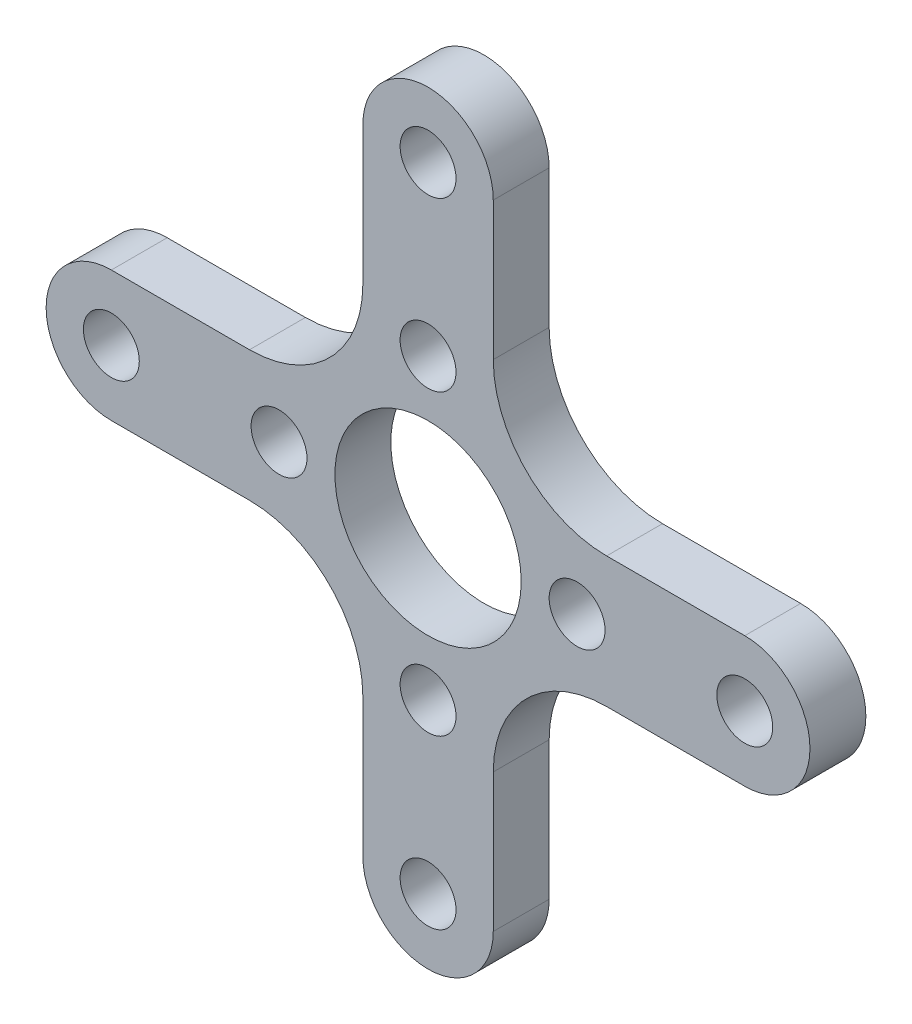
ISO-10303-21;
HEADER;
FILE_DESCRIPTION(('STEP AP214'),'2;1');
FILE_NAME('part.step','',(''),(''),'','','');
FILE_SCHEMA(('AUTOMOTIVE_DESIGN { 1 0 10303 214 1 1 1 1 }'));
ENDSEC;
DATA;
#1=APPLICATION_CONTEXT('core data for automotive mechanical design processes');
#2=APPLICATION_PROTOCOL_DEFINITION('international standard','automotive_design',2000,#1);
#3=PRODUCT_CONTEXT('',#1,'mechanical');
#4=PRODUCT('Part','Part','',(#3));
#5=PRODUCT_RELATED_PRODUCT_CATEGORY('part','',(#4));
#6=PRODUCT_DEFINITION_FORMATION('','',#4);
#7=PRODUCT_DEFINITION_CONTEXT('part definition',#1,'design');
#8=PRODUCT_DEFINITION('design','',#6,#7);
#9=PRODUCT_DEFINITION_SHAPE('','',#8);
#10=(LENGTH_UNIT() NAMED_UNIT(*) SI_UNIT(.MILLI.,.METRE.));
#11=(NAMED_UNIT(*) PLANE_ANGLE_UNIT() SI_UNIT($,.RADIAN.));
#12=(NAMED_UNIT(*) SI_UNIT($,.STERADIAN.) SOLID_ANGLE_UNIT());
#13=UNCERTAINTY_MEASURE_WITH_UNIT(LENGTH_MEASURE(1.E-05),#10,'distance_accuracy_value','');
#14=(GEOMETRIC_REPRESENTATION_CONTEXT(3) GLOBAL_UNCERTAINTY_ASSIGNED_CONTEXT((#13)) GLOBAL_UNIT_ASSIGNED_CONTEXT((#10,
#11,#12)) REPRESENTATION_CONTEXT('',''));
#15=CARTESIAN_POINT('',(0.,0.,0.));
#16=DIRECTION('',(0.,0.,1.));
#17=DIRECTION('',(1.,0.,0.));
#18=AXIS2_PLACEMENT_3D('',#15,#16,#17);
#19=CARTESIAN_POINT('',(0.,17.,3.));
#20=DIRECTION('',(0.,0.,-1.));
#21=DIRECTION('',(-1.,0.,0.));
#22=AXIS2_PLACEMENT_3D('',#19,#20,#21);
#23=PLANE('',#22);
#24=CARTESIAN_POINT('',(-8.00000000000003,0.,3.));
#25=DIRECTION('',(0.,0.,1.));
#26=DIRECTION('',(1.,0.,0.));
#27=AXIS2_PLACEMENT_3D('',#24,#25,#26);
#28=CIRCLE('',#27,1.5);
#29=CARTESIAN_POINT('',(-6.50000000000003,0.,3.));
#30=VERTEX_POINT('',#29);
#31=EDGE_CURVE('E367',#30,#30,#28,.T.);
#32=ORIENTED_EDGE('',*,*,#31,.F.);
#33=EDGE_LOOP('',(#32));
#34=FACE_BOUND('',#33,.T.);
#35=CARTESIAN_POINT('',(1.78065548281E-13,17.,3.));
#36=DIRECTION('',(0.,0.,1.));
#37=DIRECTION('',(1.,0.,0.));
#38=AXIS2_PLACEMENT_3D('',#35,#36,#37);
#39=CIRCLE('',#38,1.5);
#40=CARTESIAN_POINT('',(1.50000000000018,17.,3.));
#41=VERTEX_POINT('',#40);
#42=EDGE_CURVE('E360',#41,#41,#39,.T.);
#43=ORIENTED_EDGE('',*,*,#42,.F.);
#44=EDGE_LOOP('',(#43));
#45=FACE_BOUND('',#44,.T.);
#46=CARTESIAN_POINT('',(0.,8.00000000000003,3.));
#47=DIRECTION('',(0.,0.,1.));
#48=DIRECTION('',(1.,0.,0.));
#49=AXIS2_PLACEMENT_3D('',#46,#47,#48);
#50=CIRCLE('',#49,1.5);
#51=CARTESIAN_POINT('',(1.50000000000009,8.00000000000003,3.));
#52=VERTEX_POINT('',#51);
#53=EDGE_CURVE('E357',#52,#52,#50,.T.);
#54=ORIENTED_EDGE('',*,*,#53,.F.);
#55=EDGE_LOOP('',(#54));
#56=FACE_BOUND('',#55,.T.);
#57=CARTESIAN_POINT('',(0.,-17.,3.));
#58=DIRECTION('',(0.,0.,1.));
#59=DIRECTION('',(1.,0.,0.));
#60=AXIS2_PLACEMENT_3D('',#57,#58,#59);
#61=CIRCLE('',#60,1.5);
#62=CARTESIAN_POINT('',(1.49999999999994,-17.,3.));
#63=VERTEX_POINT('',#62);
#64=EDGE_CURVE('E378',#63,#63,#61,.T.);
#65=ORIENTED_EDGE('',*,*,#64,.F.);
#66=EDGE_LOOP('',(#65));
#67=FACE_BOUND('',#66,.T.);
#68=CARTESIAN_POINT('',(0.,-8.00000000000003,3.));
#69=DIRECTION('',(0.,0.,1.));
#70=DIRECTION('',(1.,0.,0.));
#71=AXIS2_PLACEMENT_3D('',#68,#69,#70);
#72=CIRCLE('',#71,1.5);
#73=CARTESIAN_POINT('',(1.49999999999997,-8.00000000000003,3.));
#74=VERTEX_POINT('',#73);
#75=EDGE_CURVE('E379',#74,#74,#72,.T.);
#76=ORIENTED_EDGE('',*,*,#75,.F.);
#77=EDGE_LOOP('',(#76));
#78=FACE_BOUND('',#77,.T.);
#79=CARTESIAN_POINT('',(-17.,1.18710365520667E-13,3.));
#80=DIRECTION('',(0.,0.,1.));
#81=DIRECTION('',(1.,0.,0.));
#82=AXIS2_PLACEMENT_3D('',#79,#80,#81);
#83=CIRCLE('',#82,1.5);
#84=CARTESIAN_POINT('',(-15.5,1.18710365520667E-13,3.));
#85=VERTEX_POINT('',#84);
#86=EDGE_CURVE('E366',#85,#85,#83,.T.);
#87=ORIENTED_EDGE('',*,*,#86,.F.);
#88=EDGE_LOOP('',(#87));
#89=FACE_BOUND('',#88,.T.);
#90=CARTESIAN_POINT('',(0.,17.,3.));
#91=DIRECTION('',(0.,0.,1.));
#92=DIRECTION('',(-1.,0.,0.));
#93=AXIS2_PLACEMENT_3D('',#90,#91,#92);
#94=CIRCLE('',#93,3.49999999999999);
#95=CARTESIAN_POINT('',(3.50000000000002,17.,3.));
#96=VERTEX_POINT('',#95);
#97=CARTESIAN_POINT('',(-3.49999999999996,17.,3.));
#98=VERTEX_POINT('',#97);
#99=EDGE_CURVE('E208',#96,#98,#94,.T.);
#100=ORIENTED_EDGE('',*,*,#99,.T.);
#101=DIRECTION('',(0.,-1.,0.));
#102=VECTOR('',#101,1.);
#103=CARTESIAN_POINT('',(-3.49999999999997,9.58442784262123,3.));
#104=LINE('',#103,#102);
#105=CARTESIAN_POINT('',(-3.49999999999997,9.58442784262123,3.));
#106=VERTEX_POINT('',#105);
#107=EDGE_CURVE('E116',#98,#106,#104,.T.);
#108=ORIENTED_EDGE('',*,*,#107,.T.);
#109=CARTESIAN_POINT('',(-9.58442784262122,9.58442784262125,3.));
#110=DIRECTION('',(0.,0.,-1.));
#111=DIRECTION('',(1.,0.,0.));
#112=AXIS2_PLACEMENT_3D('',#109,#110,#111);
#113=CIRCLE('',#112,6.08442784262125);
#114=CARTESIAN_POINT('',(-9.58442784262122,3.5,3.));
#115=VERTEX_POINT('',#114);
#116=EDGE_CURVE('E247',#106,#115,#113,.T.);
#117=ORIENTED_EDGE('',*,*,#116,.T.);
#118=DIRECTION('',(-1.,0.,0.));
#119=VECTOR('',#118,1.);
#120=CARTESIAN_POINT('',(-9.58442784262121,3.5,3.));
#121=LINE('',#120,#119);
#122=CARTESIAN_POINT('',(-17.,3.49999999999999,3.));
#123=VERTEX_POINT('',#122);
#124=EDGE_CURVE('E266',#115,#123,#121,.T.);
#125=ORIENTED_EDGE('',*,*,#124,.T.);
#126=CARTESIAN_POINT('',(-17.,0.,3.));
#127=DIRECTION('',(0.,0.,1.));
#128=DIRECTION('',(-1.,0.,0.));
#129=AXIS2_PLACEMENT_3D('',#126,#127,#128);
#130=CIRCLE('',#129,3.49999999999999);
#131=CARTESIAN_POINT('',(-17.,-3.49999999999999,3.));
#132=VERTEX_POINT('',#131);
#133=EDGE_CURVE('E263',#123,#132,#130,.T.);
#134=ORIENTED_EDGE('',*,*,#133,.T.);
#135=DIRECTION('',(1.,0.,0.));
#136=VECTOR('',#135,1.);
#137=CARTESIAN_POINT('',(-9.58442784262119,-3.50000000000001,3.));
#138=LINE('',#137,#136);
#139=CARTESIAN_POINT('',(-9.58442784262119,-3.50000000000001,3.));
#140=VERTEX_POINT('',#139);
#141=EDGE_CURVE('E265',#132,#140,#138,.T.);
#142=ORIENTED_EDGE('',*,*,#141,.T.);
#143=CARTESIAN_POINT('',(-9.58442784262121,-9.58442784262125,3.));
#144=DIRECTION('',(0.,0.,-1.));
#145=DIRECTION('',(1.,0.,0.));
#146=AXIS2_PLACEMENT_3D('',#143,#144,#145);
#147=CIRCLE('',#146,6.08442784262125);
#148=CARTESIAN_POINT('',(-3.49999999999997,-9.58442784262125,3.));
#149=VERTEX_POINT('',#148);
#150=EDGE_CURVE('E268',#140,#149,#147,.T.);
#151=ORIENTED_EDGE('',*,*,#150,.T.);
#152=DIRECTION('',(0.,-1.,0.));
#153=VECTOR('',#152,1.);
#154=CARTESIAN_POINT('',(-3.49999999999996,-9.58442784262125,3.));
#155=LINE('',#154,#153);
#156=CARTESIAN_POINT('',(-3.49999999999995,-17.,3.));
#157=VERTEX_POINT('',#156);
#158=EDGE_CURVE('E274',#149,#157,#155,.T.);
#159=ORIENTED_EDGE('',*,*,#158,.T.);
#160=CARTESIAN_POINT('',(0.,-17.,3.));
#161=DIRECTION('',(0.,0.,1.));
#162=DIRECTION('',(-1.,0.,0.));
#163=AXIS2_PLACEMENT_3D('',#160,#161,#162);
#164=CIRCLE('',#163,3.49999999999999);
#165=CARTESIAN_POINT('',(3.50000000000003,-17.,3.));
#166=VERTEX_POINT('',#165);
#167=EDGE_CURVE('E276',#157,#166,#164,.T.);
#168=ORIENTED_EDGE('',*,*,#167,.T.);
#169=DIRECTION('',(0.,1.,0.));
#170=VECTOR('',#169,1.);
#171=CARTESIAN_POINT('',(3.50000000000003,-9.58442784262123,3.));
#172=LINE('',#171,#170);
#173=CARTESIAN_POINT('',(3.50000000000003,-9.58442784262123,3.));
#174=VERTEX_POINT('',#173);
#175=EDGE_CURVE('E278',#166,#174,#172,.T.);
#176=ORIENTED_EDGE('',*,*,#175,.T.);
#177=CARTESIAN_POINT('',(9.58442784262128,-9.58442784262125,3.));
#178=DIRECTION('',(0.,0.,-1.));
#179=DIRECTION('',(1.,0.,0.));
#180=AXIS2_PLACEMENT_3D('',#177,#178,#179);
#181=CIRCLE('',#180,6.08442784262125);
#182=CARTESIAN_POINT('',(9.58442784262128,-3.5,3.));
#183=VERTEX_POINT('',#182);
#184=EDGE_CURVE('E280',#174,#183,#181,.T.);
#185=ORIENTED_EDGE('',*,*,#184,.T.);
#186=DIRECTION('',(1.,0.,0.));
#187=VECTOR('',#186,1.);
#188=CARTESIAN_POINT('',(9.58442784262128,-3.5,3.));
#189=LINE('',#188,#187);
#190=CARTESIAN_POINT('',(17.,-3.49999999999999,3.));
#191=VERTEX_POINT('',#190);
#192=EDGE_CURVE('E282',#183,#191,#189,.T.);
#193=ORIENTED_EDGE('',*,*,#192,.T.);
#194=CARTESIAN_POINT('',(17.,0.,3.));
#195=DIRECTION('',(0.,0.,1.));
#196=DIRECTION('',(-1.,0.,0.));
#197=AXIS2_PLACEMENT_3D('',#194,#195,#196);
#198=CIRCLE('',#197,3.49999999999999);
#199=CARTESIAN_POINT('',(17.,3.49999999999999,3.));
#200=VERTEX_POINT('',#199);
#201=EDGE_CURVE('E159',#191,#200,#198,.T.);
#202=ORIENTED_EDGE('',*,*,#201,.T.);
#203=DIRECTION('',(-1.,0.,0.));
#204=VECTOR('',#203,1.);
#205=CARTESIAN_POINT('',(9.58442784262126,3.5,3.));
#206=LINE('',#205,#204);
#207=CARTESIAN_POINT('',(9.58442784262126,3.5,3.));
#208=VERTEX_POINT('',#207);
#209=EDGE_CURVE('E153',#200,#208,#206,.T.);
#210=ORIENTED_EDGE('',*,*,#209,.T.);
#211=CARTESIAN_POINT('',(9.58442784262128,9.58442784262125,3.));
#212=DIRECTION('',(0.,0.,-1.));
#213=DIRECTION('',(1.,0.,0.));
#214=AXIS2_PLACEMENT_3D('',#211,#212,#213);
#215=CIRCLE('',#214,6.08442784262125);
#216=CARTESIAN_POINT('',(3.50000000000003,9.58442784262125,3.));
#217=VERTEX_POINT('',#216);
#218=EDGE_CURVE('E157',#208,#217,#215,.T.);
#219=ORIENTED_EDGE('',*,*,#218,.T.);
#220=DIRECTION('',(0.,1.,0.));
#221=VECTOR('',#220,1.);
#222=CARTESIAN_POINT('',(3.50000000000003,9.58442784262125,3.));
#223=LINE('',#222,#221);
#224=EDGE_CURVE('E49',#217,#96,#223,.T.);
#225=ORIENTED_EDGE('',*,*,#224,.T.);
#226=EDGE_LOOP('',(#100,#108,#117,#125,#134,#142,#151,#159,#168,#176,#185,#193,#202,#210,#219,#225));
#227=FACE_BOUND('',#226,.T.);
#228=CARTESIAN_POINT('',(0.,0.,3.));
#229=DIRECTION('',(0.,0.,1.));
#230=DIRECTION('',(1.,0.,0.));
#231=AXIS2_PLACEMENT_3D('',#228,#229,#230);
#232=CIRCLE('',#231,5.);
#233=CARTESIAN_POINT('',(5.,0.,3.));
#234=VERTEX_POINT('',#233);
#235=EDGE_CURVE('E181',#234,#234,#232,.T.);
#236=ORIENTED_EDGE('',*,*,#235,.F.);
#237=EDGE_LOOP('',(#236));
#238=FACE_BOUND('',#237,.T.);
#239=CARTESIAN_POINT('',(8.00000000000003,0.,3.));
#240=DIRECTION('',(0.,0.,1.));
#241=DIRECTION('',(1.,0.,0.));
#242=AXIS2_PLACEMENT_3D('',#239,#240,#241);
#243=CIRCLE('',#242,1.5);
#244=CARTESIAN_POINT('',(9.50000000000003,0.,3.));
#245=VERTEX_POINT('',#244);
#246=EDGE_CURVE('E399',#245,#245,#243,.T.);
#247=ORIENTED_EDGE('',*,*,#246,.F.);
#248=EDGE_LOOP('',(#247));
#249=FACE_BOUND('',#248,.T.);
#250=CARTESIAN_POINT('',(17.,0.,3.));
#251=DIRECTION('',(0.,0.,1.));
#252=DIRECTION('',(1.,0.,0.));
#253=AXIS2_PLACEMENT_3D('',#250,#251,#252);
#254=CIRCLE('',#253,1.5);
#255=CARTESIAN_POINT('',(18.5,0.,3.));
#256=VERTEX_POINT('',#255);
#257=EDGE_CURVE('E393',#256,#256,#254,.T.);
#258=ORIENTED_EDGE('',*,*,#257,.F.);
#259=EDGE_LOOP('',(#258));
#260=FACE_BOUND('',#259,.T.);
#261=ADVANCED_FACE('F32',(#34,#45,#56,#67,#78,#89,#227,#238,#249,#260),#23,.F.);
#262=CARTESIAN_POINT('',(0.,17.,0.));
#263=DIRECTION('',(0.,0.,-1.));
#264=DIRECTION('',(-1.,0.,0.));
#265=AXIS2_PLACEMENT_3D('',#262,#263,#264);
#266=PLANE('',#265);
#267=CARTESIAN_POINT('',(-8.00000000000003,0.,0.));
#268=DIRECTION('',(0.,0.,1.));
#269=DIRECTION('',(1.,0.,0.));
#270=AXIS2_PLACEMENT_3D('',#267,#268,#269);
#271=CIRCLE('',#270,1.5);
#272=CARTESIAN_POINT('',(-6.50000000000003,0.,0.));
#273=VERTEX_POINT('',#272);
#274=EDGE_CURVE('E363',#273,#273,#271,.T.);
#275=ORIENTED_EDGE('',*,*,#274,.T.);
#276=EDGE_LOOP('',(#275));
#277=FACE_BOUND('',#276,.T.);
#278=CARTESIAN_POINT('',(1.78065548281E-13,17.,0.));
#279=DIRECTION('',(0.,0.,1.));
#280=DIRECTION('',(1.,0.,0.));
#281=AXIS2_PLACEMENT_3D('',#278,#279,#280);
#282=CIRCLE('',#281,1.5);
#283=CARTESIAN_POINT('',(1.50000000000018,17.,0.));
#284=VERTEX_POINT('',#283);
#285=EDGE_CURVE('E370',#284,#284,#282,.T.);
#286=ORIENTED_EDGE('',*,*,#285,.T.);
#287=EDGE_LOOP('',(#286));
#288=FACE_BOUND('',#287,.T.);
#289=CARTESIAN_POINT('',(0.,8.00000000000003,0.));
#290=DIRECTION('',(0.,0.,1.));
#291=DIRECTION('',(1.,0.,0.));
#292=AXIS2_PLACEMENT_3D('',#289,#290,#291);
#293=CIRCLE('',#292,1.5);
#294=CARTESIAN_POINT('',(1.50000000000009,8.00000000000003,0.));
#295=VERTEX_POINT('',#294);
#296=EDGE_CURVE('E354',#295,#295,#293,.T.);
#297=ORIENTED_EDGE('',*,*,#296,.T.);
#298=EDGE_LOOP('',(#297));
#299=FACE_BOUND('',#298,.T.);
#300=CARTESIAN_POINT('',(0.,-17.,0.));
#301=DIRECTION('',(0.,0.,1.));
#302=DIRECTION('',(1.,0.,0.));
#303=AXIS2_PLACEMENT_3D('',#300,#301,#302);
#304=CIRCLE('',#303,1.5);
#305=CARTESIAN_POINT('',(1.49999999999994,-17.,0.));
#306=VERTEX_POINT('',#305);
#307=EDGE_CURVE('E387',#306,#306,#304,.T.);
#308=ORIENTED_EDGE('',*,*,#307,.T.);
#309=EDGE_LOOP('',(#308));
#310=FACE_BOUND('',#309,.T.);
#311=CARTESIAN_POINT('',(0.,-8.00000000000003,0.));
#312=DIRECTION('',(0.,0.,1.));
#313=DIRECTION('',(1.,0.,0.));
#314=AXIS2_PLACEMENT_3D('',#311,#312,#313);
#315=CIRCLE('',#314,1.5);
#316=CARTESIAN_POINT('',(1.49999999999997,-8.00000000000003,0.));
#317=VERTEX_POINT('',#316);
#318=EDGE_CURVE('E375',#317,#317,#315,.T.);
#319=ORIENTED_EDGE('',*,*,#318,.T.);
#320=EDGE_LOOP('',(#319));
#321=FACE_BOUND('',#320,.T.);
#322=CARTESIAN_POINT('',(-17.,1.18710365520667E-13,0.));
#323=DIRECTION('',(0.,0.,1.));
#324=DIRECTION('',(1.,0.,0.));
#325=AXIS2_PLACEMENT_3D('',#322,#323,#324);
#326=CIRCLE('',#325,1.5);
#327=CARTESIAN_POINT('',(-15.5,1.18710365520667E-13,0.));
#328=VERTEX_POINT('',#327);
#329=EDGE_CURVE('E382',#328,#328,#326,.T.);
#330=ORIENTED_EDGE('',*,*,#329,.T.);
#331=EDGE_LOOP('',(#330));
#332=FACE_BOUND('',#331,.T.);
#333=CARTESIAN_POINT('',(8.00000000000003,0.,0.));
#334=DIRECTION('',(0.,0.,1.));
#335=DIRECTION('',(1.,0.,0.));
#336=AXIS2_PLACEMENT_3D('',#333,#334,#335);
#337=CIRCLE('',#336,1.5);
#338=CARTESIAN_POINT('',(9.50000000000003,0.,0.));
#339=VERTEX_POINT('',#338);
#340=EDGE_CURVE('E396',#339,#339,#337,.T.);
#341=ORIENTED_EDGE('',*,*,#340,.T.);
#342=EDGE_LOOP('',(#341));
#343=FACE_BOUND('',#342,.T.);
#344=CARTESIAN_POINT('',(0.,17.,0.));
#345=DIRECTION('',(0.,0.,1.));
#346=DIRECTION('',(-1.,0.,0.));
#347=AXIS2_PLACEMENT_3D('',#344,#345,#346);
#348=CIRCLE('',#347,3.49999999999999);
#349=CARTESIAN_POINT('',(3.50000000000002,17.,0.));
#350=VERTEX_POINT('',#349);
#351=CARTESIAN_POINT('',(-3.49999999999996,17.,0.));
#352=VERTEX_POINT('',#351);
#353=EDGE_CURVE('E177',#350,#352,#348,.T.);
#354=ORIENTED_EDGE('',*,*,#353,.F.);
#355=DIRECTION('',(0.,1.,0.));
#356=VECTOR('',#355,1.);
#357=CARTESIAN_POINT('',(3.50000000000003,9.58442784262125,0.));
#358=LINE('',#357,#356);
#359=CARTESIAN_POINT('',(3.50000000000003,9.58442784262125,0.));
#360=VERTEX_POINT('',#359);
#361=EDGE_CURVE('E108',#360,#350,#358,.T.);
#362=ORIENTED_EDGE('',*,*,#361,.F.);
#363=CARTESIAN_POINT('',(9.58442784262128,9.58442784262125,0.));
#364=DIRECTION('',(0.,0.,-1.));
#365=DIRECTION('',(1.,0.,0.));
#366=AXIS2_PLACEMENT_3D('',#363,#364,#365);
#367=CIRCLE('',#366,6.08442784262125);
#368=CARTESIAN_POINT('',(9.58442784262126,3.5,0.));
#369=VERTEX_POINT('',#368);
#370=EDGE_CURVE('E102',#369,#360,#367,.T.);
#371=ORIENTED_EDGE('',*,*,#370,.F.);
#372=DIRECTION('',(-1.,0.,0.));
#373=VECTOR('',#372,1.);
#374=CARTESIAN_POINT('',(9.58442784262126,3.5,0.));
#375=LINE('',#374,#373);
#376=CARTESIAN_POINT('',(17.,3.49999999999999,0.));
#377=VERTEX_POINT('',#376);
#378=EDGE_CURVE('E167',#377,#369,#375,.T.);
#379=ORIENTED_EDGE('',*,*,#378,.F.);
#380=CARTESIAN_POINT('',(17.,0.,0.));
#381=DIRECTION('',(0.,0.,1.));
#382=DIRECTION('',(-1.,0.,0.));
#383=AXIS2_PLACEMENT_3D('',#380,#381,#382);
#384=CIRCLE('',#383,3.49999999999999);
#385=CARTESIAN_POINT('',(17.,-3.49999999999999,0.));
#386=VERTEX_POINT('',#385);
#387=EDGE_CURVE('E203',#386,#377,#384,.T.);
#388=ORIENTED_EDGE('',*,*,#387,.F.);
#389=DIRECTION('',(1.,0.,0.));
#390=VECTOR('',#389,1.);
#391=CARTESIAN_POINT('',(9.58442784262128,-3.5,0.));
#392=LINE('',#391,#390);
#393=CARTESIAN_POINT('',(9.58442784262128,-3.5,0.));
#394=VERTEX_POINT('',#393);
#395=EDGE_CURVE('E201',#394,#386,#392,.T.);
#396=ORIENTED_EDGE('',*,*,#395,.F.);
#397=CARTESIAN_POINT('',(9.58442784262128,-9.58442784262125,0.));
#398=DIRECTION('',(0.,0.,-1.));
#399=DIRECTION('',(1.,0.,0.));
#400=AXIS2_PLACEMENT_3D('',#397,#398,#399);
#401=CIRCLE('',#400,6.08442784262125);
#402=CARTESIAN_POINT('',(3.50000000000003,-9.58442784262123,0.));
#403=VERTEX_POINT('',#402);
#404=EDGE_CURVE('E199',#403,#394,#401,.T.);
#405=ORIENTED_EDGE('',*,*,#404,.F.);
#406=DIRECTION('',(0.,1.,0.));
#407=VECTOR('',#406,1.);
#408=CARTESIAN_POINT('',(3.50000000000003,-9.58442784262123,0.));
#409=LINE('',#408,#407);
#410=CARTESIAN_POINT('',(3.50000000000003,-17.,0.));
#411=VERTEX_POINT('',#410);
#412=EDGE_CURVE('E197',#411,#403,#409,.T.);
#413=ORIENTED_EDGE('',*,*,#412,.F.);
#414=CARTESIAN_POINT('',(0.,-17.,0.));
#415=DIRECTION('',(0.,0.,1.));
#416=DIRECTION('',(-1.,0.,0.));
#417=AXIS2_PLACEMENT_3D('',#414,#415,#416);
#418=CIRCLE('',#417,3.49999999999999);
#419=CARTESIAN_POINT('',(-3.49999999999995,-17.,0.));
#420=VERTEX_POINT('',#419);
#421=EDGE_CURVE('E195',#420,#411,#418,.T.);
#422=ORIENTED_EDGE('',*,*,#421,.F.);
#423=DIRECTION('',(0.,-1.,0.));
#424=VECTOR('',#423,1.);
#425=CARTESIAN_POINT('',(-3.49999999999996,-9.58442784262125,0.));
#426=LINE('',#425,#424);
#427=CARTESIAN_POINT('',(-3.49999999999997,-9.58442784262125,0.));
#428=VERTEX_POINT('',#427);
#429=EDGE_CURVE('E193',#428,#420,#426,.T.);
#430=ORIENTED_EDGE('',*,*,#429,.F.);
#431=CARTESIAN_POINT('',(-9.58442784262121,-9.58442784262125,0.));
#432=DIRECTION('',(0.,0.,-1.));
#433=DIRECTION('',(1.,0.,0.));
#434=AXIS2_PLACEMENT_3D('',#431,#432,#433);
#435=CIRCLE('',#434,6.08442784262125);
#436=CARTESIAN_POINT('',(-9.58442784262119,-3.50000000000001,0.));
#437=VERTEX_POINT('',#436);
#438=EDGE_CURVE('E191',#437,#428,#435,.T.);
#439=ORIENTED_EDGE('',*,*,#438,.F.);
#440=DIRECTION('',(1.,0.,0.));
#441=VECTOR('',#440,1.);
#442=CARTESIAN_POINT('',(-9.58442784262119,-3.50000000000001,0.));
#443=LINE('',#442,#441);
#444=CARTESIAN_POINT('',(-17.,-3.49999999999999,0.));
#445=VERTEX_POINT('',#444);
#446=EDGE_CURVE('E189',#445,#437,#443,.T.);
#447=ORIENTED_EDGE('',*,*,#446,.F.);
#448=CARTESIAN_POINT('',(-17.,0.,0.));
#449=DIRECTION('',(0.,0.,1.));
#450=DIRECTION('',(-1.,0.,0.));
#451=AXIS2_PLACEMENT_3D('',#448,#449,#450);
#452=CIRCLE('',#451,3.49999999999999);
#453=CARTESIAN_POINT('',(-17.,3.49999999999999,0.));
#454=VERTEX_POINT('',#453);
#455=EDGE_CURVE('E187',#454,#445,#452,.T.);
#456=ORIENTED_EDGE('',*,*,#455,.F.);
#457=DIRECTION('',(-1.,0.,0.));
#458=VECTOR('',#457,1.);
#459=CARTESIAN_POINT('',(-9.58442784262121,3.5,0.));
#460=LINE('',#459,#458);
#461=CARTESIAN_POINT('',(-9.58442784262122,3.5,0.));
#462=VERTEX_POINT('',#461);
#463=EDGE_CURVE('E185',#462,#454,#460,.T.);
#464=ORIENTED_EDGE('',*,*,#463,.F.);
#465=CARTESIAN_POINT('',(-9.58442784262122,9.58442784262125,0.));
#466=DIRECTION('',(0.,0.,-1.));
#467=DIRECTION('',(1.,0.,0.));
#468=AXIS2_PLACEMENT_3D('',#465,#466,#467);
#469=CIRCLE('',#468,6.08442784262125);
#470=CARTESIAN_POINT('',(-3.49999999999997,9.58442784262123,0.));
#471=VERTEX_POINT('',#470);
#472=EDGE_CURVE('E183',#471,#462,#469,.T.);
#473=ORIENTED_EDGE('',*,*,#472,.F.);
#474=DIRECTION('',(0.,-1.,0.));
#475=VECTOR('',#474,1.);
#476=CARTESIAN_POINT('',(-3.49999999999997,9.58442784262123,0.));
#477=LINE('',#476,#475);
#478=EDGE_CURVE('E180',#352,#471,#477,.T.);
#479=ORIENTED_EDGE('',*,*,#478,.F.);
#480=EDGE_LOOP('',(#354,#362,#371,#379,#388,#396,#405,#413,#422,#430,#439,#447,#456,#464,#473,#479));
#481=FACE_BOUND('',#480,.T.);
#482=CARTESIAN_POINT('',(0.,0.,0.));
#483=DIRECTION('',(0.,0.,1.));
#484=DIRECTION('',(1.,0.,0.));
#485=AXIS2_PLACEMENT_3D('',#482,#483,#484);
#486=CIRCLE('',#485,5.);
#487=CARTESIAN_POINT('',(5.,0.,0.));
#488=VERTEX_POINT('',#487);
#489=EDGE_CURVE('E402',#488,#488,#486,.T.);
#490=ORIENTED_EDGE('',*,*,#489,.T.);
#491=EDGE_LOOP('',(#490));
#492=FACE_BOUND('',#491,.T.);
#493=CARTESIAN_POINT('',(17.,0.,0.));
#494=DIRECTION('',(0.,0.,1.));
#495=DIRECTION('',(1.,0.,0.));
#496=AXIS2_PLACEMENT_3D('',#493,#494,#495);
#497=CIRCLE('',#496,1.5);
#498=CARTESIAN_POINT('',(18.5,0.,0.));
#499=VERTEX_POINT('',#498);
#500=EDGE_CURVE('E390',#499,#499,#497,.T.);
#501=ORIENTED_EDGE('',*,*,#500,.T.);
#502=EDGE_LOOP('',(#501));
#503=FACE_BOUND('',#502,.T.);
#504=ADVANCED_FACE('F251',(#277,#288,#299,#310,#321,#332,#343,#481,#492,#503),#266,.T.);
#505=CARTESIAN_POINT('',(0.,17.,3.));
#506=DIRECTION('',(0.,0.,-1.));
#507=DIRECTION('',(-1.,0.,0.));
#508=AXIS2_PLACEMENT_3D('',#505,#506,#507);
#509=CYLINDRICAL_SURFACE('',#508,3.49999999999999);
#510=ORIENTED_EDGE('',*,*,#353,.T.);
#511=DIRECTION('',(0.,0.,-1.));
#512=VECTOR('',#511,1.);
#513=CARTESIAN_POINT('',(-3.49999999999996,17.,3.));
#514=LINE('',#513,#512);
#515=EDGE_CURVE('E11',#98,#352,#514,.T.);
#516=ORIENTED_EDGE('',*,*,#515,.F.);
#517=ORIENTED_EDGE('',*,*,#99,.F.);
#518=DIRECTION('',(0.,0.,-1.));
#519=VECTOR('',#518,1.);
#520=CARTESIAN_POINT('',(3.50000000000002,17.,3.));
#521=LINE('',#520,#519);
#522=EDGE_CURVE('E173',#96,#350,#521,.T.);
#523=ORIENTED_EDGE('',*,*,#522,.T.);
#524=EDGE_LOOP('',(#510,#516,#517,#523));
#525=FACE_BOUND('',#524,.T.);
#526=ADVANCED_FACE('F34',(#525),#509,.T.);
#527=CARTESIAN_POINT('',(-3.49999999999997,9.58442784262123,3.));
#528=DIRECTION('',(1.,0.,0.));
#529=DIRECTION('',(0.,1.,0.));
#530=AXIS2_PLACEMENT_3D('',#527,#528,#529);
#531=PLANE('',#530);
#532=ORIENTED_EDGE('',*,*,#478,.T.);
#533=DIRECTION('',(0.,0.,-1.));
#534=VECTOR('',#533,1.);
#535=CARTESIAN_POINT('',(-3.49999999999997,9.58442784262123,3.));
#536=LINE('',#535,#534);
#537=EDGE_CURVE('E41',#106,#471,#536,.T.);
#538=ORIENTED_EDGE('',*,*,#537,.F.);
#539=ORIENTED_EDGE('',*,*,#107,.F.);
#540=ORIENTED_EDGE('',*,*,#515,.T.);
#541=EDGE_LOOP('',(#532,#538,#539,#540));
#542=FACE_BOUND('',#541,.T.);
#543=ADVANCED_FACE('F597',(#542),#531,.F.);
#544=CARTESIAN_POINT('',(-9.58442784262122,9.58442784262125,3.));
#545=DIRECTION('',(0.,0.,-1.));
#546=DIRECTION('',(-1.,0.,0.));
#547=AXIS2_PLACEMENT_3D('',#544,#545,#546);
#548=CYLINDRICAL_SURFACE('',#547,6.08442784262125);
#549=ORIENTED_EDGE('',*,*,#472,.T.);
#550=DIRECTION('',(0.,0.,-1.));
#551=VECTOR('',#550,1.);
#552=CARTESIAN_POINT('',(-9.58442784262122,3.5,3.));
#553=LINE('',#552,#551);
#554=EDGE_CURVE('E239',#115,#462,#553,.T.);
#555=ORIENTED_EDGE('',*,*,#554,.F.);
#556=ORIENTED_EDGE('',*,*,#116,.F.);
#557=ORIENTED_EDGE('',*,*,#537,.T.);
#558=EDGE_LOOP('',(#549,#555,#556,#557));
#559=FACE_BOUND('',#558,.T.);
#560=ADVANCED_FACE('F245',(#559),#548,.F.);
#561=CARTESIAN_POINT('',(-9.58442784262121,3.5,3.));
#562=DIRECTION('',(0.,-1.,0.));
#563=DIRECTION('',(1.,0.,0.));
#564=AXIS2_PLACEMENT_3D('',#561,#562,#563);
#565=PLANE('',#564);
#566=ORIENTED_EDGE('',*,*,#463,.T.);
#567=DIRECTION('',(0.,0.,-1.));
#568=VECTOR('',#567,1.);
#569=CARTESIAN_POINT('',(-17.,3.49999999999999,3.));
#570=LINE('',#569,#568);
#571=EDGE_CURVE('E236',#123,#454,#570,.T.);
#572=ORIENTED_EDGE('',*,*,#571,.F.);
#573=ORIENTED_EDGE('',*,*,#124,.F.);
#574=ORIENTED_EDGE('',*,*,#554,.T.);
#575=EDGE_LOOP('',(#566,#572,#573,#574));
#576=FACE_BOUND('',#575,.T.);
#577=ADVANCED_FACE('F257',(#576),#565,.F.);
#578=CARTESIAN_POINT('',(-17.,0.,3.));
#579=DIRECTION('',(0.,0.,-1.));
#580=DIRECTION('',(-1.,0.,0.));
#581=AXIS2_PLACEMENT_3D('',#578,#579,#580);
#582=CYLINDRICAL_SURFACE('',#581,3.49999999999999);
#583=ORIENTED_EDGE('',*,*,#455,.T.);
#584=DIRECTION('',(0.,0.,-1.));
#585=VECTOR('',#584,1.);
#586=CARTESIAN_POINT('',(-17.,-3.49999999999999,3.));
#587=LINE('',#586,#585);
#588=EDGE_CURVE('E233',#132,#445,#587,.T.);
#589=ORIENTED_EDGE('',*,*,#588,.F.);
#590=ORIENTED_EDGE('',*,*,#133,.F.);
#591=ORIENTED_EDGE('',*,*,#571,.T.);
#592=EDGE_LOOP('',(#583,#589,#590,#591));
#593=FACE_BOUND('',#592,.T.);
#594=ADVANCED_FACE('F261',(#593),#582,.T.);
#595=CARTESIAN_POINT('',(-9.58442784262119,-3.50000000000001,3.));
#596=DIRECTION('',(0.,1.,0.));
#597=DIRECTION('',(-1.,0.,0.));
#598=AXIS2_PLACEMENT_3D('',#595,#596,#597);
#599=PLANE('',#598);
#600=ORIENTED_EDGE('',*,*,#446,.T.);
#601=DIRECTION('',(0.,0.,-1.));
#602=VECTOR('',#601,1.);
#603=CARTESIAN_POINT('',(-9.58442784262119,-3.50000000000001,3.));
#604=LINE('',#603,#602);
#605=EDGE_CURVE('E230',#140,#437,#604,.T.);
#606=ORIENTED_EDGE('',*,*,#605,.F.);
#607=ORIENTED_EDGE('',*,*,#141,.F.);
#608=ORIENTED_EDGE('',*,*,#588,.T.);
#609=EDGE_LOOP('',(#600,#606,#607,#608));
#610=FACE_BOUND('',#609,.T.);
#611=ADVANCED_FACE('F566',(#610),#599,.F.);
#612=CARTESIAN_POINT('',(-9.58442784262121,-9.58442784262125,3.));
#613=DIRECTION('',(0.,0.,-1.));
#614=DIRECTION('',(-1.,0.,0.));
#615=AXIS2_PLACEMENT_3D('',#612,#613,#614);
#616=CYLINDRICAL_SURFACE('',#615,6.08442784262125);
#617=ORIENTED_EDGE('',*,*,#438,.T.);
#618=DIRECTION('',(0.,0.,-1.));
#619=VECTOR('',#618,1.);
#620=CARTESIAN_POINT('',(-3.49999999999997,-9.58442784262125,3.));
#621=LINE('',#620,#619);
#622=EDGE_CURVE('E227',#149,#428,#621,.T.);
#623=ORIENTED_EDGE('',*,*,#622,.F.);
#624=ORIENTED_EDGE('',*,*,#150,.F.);
#625=ORIENTED_EDGE('',*,*,#605,.T.);
#626=EDGE_LOOP('',(#617,#623,#624,#625));
#627=FACE_BOUND('',#626,.T.);
#628=ADVANCED_FACE('F557',(#627),#616,.F.);
#629=CARTESIAN_POINT('',(-3.49999999999996,-9.58442784262125,3.));
#630=DIRECTION('',(1.,0.,0.));
#631=DIRECTION('',(0.,1.,0.));
#632=AXIS2_PLACEMENT_3D('',#629,#630,#631);
#633=PLANE('',#632);
#634=ORIENTED_EDGE('',*,*,#429,.T.);
#635=DIRECTION('',(0.,0.,-1.));
#636=VECTOR('',#635,1.);
#637=CARTESIAN_POINT('',(-3.49999999999995,-17.,3.));
#638=LINE('',#637,#636);
#639=EDGE_CURVE('E224',#157,#420,#638,.T.);
#640=ORIENTED_EDGE('',*,*,#639,.F.);
#641=ORIENTED_EDGE('',*,*,#158,.F.);
#642=ORIENTED_EDGE('',*,*,#622,.T.);
#643=EDGE_LOOP('',(#634,#640,#641,#642));
#644=FACE_BOUND('',#643,.T.);
#645=ADVANCED_FACE('F548',(#644),#633,.F.);
#646=CARTESIAN_POINT('',(0.,-17.,3.));
#647=DIRECTION('',(0.,0.,-1.));
#648=DIRECTION('',(-1.,0.,0.));
#649=AXIS2_PLACEMENT_3D('',#646,#647,#648);
#650=CYLINDRICAL_SURFACE('',#649,3.49999999999999);
#651=ORIENTED_EDGE('',*,*,#421,.T.);
#652=DIRECTION('',(0.,0.,-1.));
#653=VECTOR('',#652,1.);
#654=CARTESIAN_POINT('',(3.50000000000003,-17.,3.));
#655=LINE('',#654,#653);
#656=EDGE_CURVE('E221',#166,#411,#655,.T.);
#657=ORIENTED_EDGE('',*,*,#656,.F.);
#658=ORIENTED_EDGE('',*,*,#167,.F.);
#659=ORIENTED_EDGE('',*,*,#639,.T.);
#660=EDGE_LOOP('',(#651,#657,#658,#659));
#661=FACE_BOUND('',#660,.T.);
#662=ADVANCED_FACE('F539',(#661),#650,.T.);
#663=CARTESIAN_POINT('',(3.50000000000003,-9.58442784262123,3.));
#664=DIRECTION('',(-1.,0.,0.));
#665=DIRECTION('',(0.,-1.,0.));
#666=AXIS2_PLACEMENT_3D('',#663,#664,#665);
#667=PLANE('',#666);
#668=ORIENTED_EDGE('',*,*,#412,.T.);
#669=DIRECTION('',(0.,0.,-1.));
#670=VECTOR('',#669,1.);
#671=CARTESIAN_POINT('',(3.50000000000003,-9.58442784262123,3.));
#672=LINE('',#671,#670);
#673=EDGE_CURVE('E218',#174,#403,#672,.T.);
#674=ORIENTED_EDGE('',*,*,#673,.F.);
#675=ORIENTED_EDGE('',*,*,#175,.F.);
#676=ORIENTED_EDGE('',*,*,#656,.T.);
#677=EDGE_LOOP('',(#668,#674,#675,#676));
#678=FACE_BOUND('',#677,.T.);
#679=ADVANCED_FACE('F530',(#678),#667,.F.);
#680=CARTESIAN_POINT('',(9.58442784262128,-9.58442784262125,3.));
#681=DIRECTION('',(0.,0.,-1.));
#682=DIRECTION('',(-1.,0.,0.));
#683=AXIS2_PLACEMENT_3D('',#680,#681,#682);
#684=CYLINDRICAL_SURFACE('',#683,6.08442784262125);
#685=ORIENTED_EDGE('',*,*,#404,.T.);
#686=DIRECTION('',(0.,0.,-1.));
#687=VECTOR('',#686,1.);
#688=CARTESIAN_POINT('',(9.58442784262128,-3.5,3.));
#689=LINE('',#688,#687);
#690=EDGE_CURVE('E215',#183,#394,#689,.T.);
#691=ORIENTED_EDGE('',*,*,#690,.F.);
#692=ORIENTED_EDGE('',*,*,#184,.F.);
#693=ORIENTED_EDGE('',*,*,#673,.T.);
#694=EDGE_LOOP('',(#685,#691,#692,#693));
#695=FACE_BOUND('',#694,.T.);
#696=ADVANCED_FACE('F522',(#695),#684,.F.);
#697=CARTESIAN_POINT('',(9.58442784262128,-3.5,3.));
#698=DIRECTION('',(0.,1.,0.));
#699=DIRECTION('',(-1.,0.,0.));
#700=AXIS2_PLACEMENT_3D('',#697,#698,#699);
#701=PLANE('',#700);
#702=ORIENTED_EDGE('',*,*,#395,.T.);
#703=DIRECTION('',(0.,0.,-1.));
#704=VECTOR('',#703,1.);
#705=CARTESIAN_POINT('',(17.,-3.49999999999999,3.));
#706=LINE('',#705,#704);
#707=EDGE_CURVE('E212',#191,#386,#706,.T.);
#708=ORIENTED_EDGE('',*,*,#707,.F.);
#709=ORIENTED_EDGE('',*,*,#192,.F.);
#710=ORIENTED_EDGE('',*,*,#690,.T.);
#711=EDGE_LOOP('',(#702,#708,#709,#710));
#712=FACE_BOUND('',#711,.T.);
#713=ADVANCED_FACE('F288',(#712),#701,.F.);
#714=CARTESIAN_POINT('',(17.,0.,3.));
#715=DIRECTION('',(0.,0.,-1.));
#716=DIRECTION('',(-1.,0.,0.));
#717=AXIS2_PLACEMENT_3D('',#714,#715,#716);
#718=CYLINDRICAL_SURFACE('',#717,3.49999999999999);
#719=ORIENTED_EDGE('',*,*,#387,.T.);
#720=DIRECTION('',(0.,0.,-1.));
#721=VECTOR('',#720,1.);
#722=CARTESIAN_POINT('',(17.,3.49999999999999,3.));
#723=LINE('',#722,#721);
#724=EDGE_CURVE('E168',#200,#377,#723,.T.);
#725=ORIENTED_EDGE('',*,*,#724,.F.);
#726=ORIENTED_EDGE('',*,*,#201,.F.);
#727=ORIENTED_EDGE('',*,*,#707,.T.);
#728=EDGE_LOOP('',(#719,#725,#726,#727));
#729=FACE_BOUND('',#728,.T.);
#730=ADVANCED_FACE('F292',(#729),#718,.T.);
#731=CARTESIAN_POINT('',(9.58442784262126,3.5,3.));
#732=DIRECTION('',(0.,-1.,0.));
#733=DIRECTION('',(1.,0.,0.));
#734=AXIS2_PLACEMENT_3D('',#731,#732,#733);
#735=PLANE('',#734);
#736=ORIENTED_EDGE('',*,*,#378,.T.);
#737=DIRECTION('',(0.,0.,-1.));
#738=VECTOR('',#737,1.);
#739=CARTESIAN_POINT('',(9.58442784262126,3.5,3.));
#740=LINE('',#739,#738);
#741=EDGE_CURVE('E164',#208,#369,#740,.T.);
#742=ORIENTED_EDGE('',*,*,#741,.F.);
#743=ORIENTED_EDGE('',*,*,#209,.F.);
#744=ORIENTED_EDGE('',*,*,#724,.T.);
#745=EDGE_LOOP('',(#736,#742,#743,#744));
#746=FACE_BOUND('',#745,.T.);
#747=ADVANCED_FACE('F165',(#746),#735,.F.);
#748=CARTESIAN_POINT('',(9.58442784262128,9.58442784262125,3.));
#749=DIRECTION('',(0.,0.,-1.));
#750=DIRECTION('',(-1.,0.,0.));
#751=AXIS2_PLACEMENT_3D('',#748,#749,#750);
#752=CYLINDRICAL_SURFACE('',#751,6.08442784262125);
#753=ORIENTED_EDGE('',*,*,#370,.T.);
#754=DIRECTION('',(0.,0.,-1.));
#755=VECTOR('',#754,1.);
#756=CARTESIAN_POINT('',(3.50000000000003,9.58442784262125,3.));
#757=LINE('',#756,#755);
#758=EDGE_CURVE('E169',#217,#360,#757,.T.);
#759=ORIENTED_EDGE('',*,*,#758,.F.);
#760=ORIENTED_EDGE('',*,*,#218,.F.);
#761=ORIENTED_EDGE('',*,*,#741,.T.);
#762=EDGE_LOOP('',(#753,#759,#760,#761));
#763=FACE_BOUND('',#762,.T.);
#764=ADVANCED_FACE('F171',(#763),#752,.F.);
#765=CARTESIAN_POINT('',(3.50000000000003,9.58442784262125,3.));
#766=DIRECTION('',(-1.,0.,0.));
#767=DIRECTION('',(0.,-1.,0.));
#768=AXIS2_PLACEMENT_3D('',#765,#766,#767);
#769=PLANE('',#768);
#770=ORIENTED_EDGE('',*,*,#361,.T.);
#771=ORIENTED_EDGE('',*,*,#522,.F.);
#772=ORIENTED_EDGE('',*,*,#224,.F.);
#773=ORIENTED_EDGE('',*,*,#758,.T.);
#774=EDGE_LOOP('',(#770,#771,#772,#773));
#775=FACE_BOUND('',#774,.T.);
#776=ADVANCED_FACE('F296',(#775),#769,.F.);
#777=CARTESIAN_POINT('',(0.,0.,3.));
#778=DIRECTION('',(0.,0.,-1.));
#779=DIRECTION('',(-1.,0.,0.));
#780=AXIS2_PLACEMENT_3D('',#777,#778,#779);
#781=CYLINDRICAL_SURFACE('',#780,5.);
#782=ORIENTED_EDGE('',*,*,#235,.T.);
#783=EDGE_LOOP('',(#782));
#784=FACE_BOUND('',#783,.T.);
#785=ORIENTED_EDGE('',*,*,#489,.F.);
#786=EDGE_LOOP('',(#785));
#787=FACE_BOUND('',#786,.T.);
#788=ADVANCED_FACE('F298',(#784,#787),#781,.F.);
#789=CARTESIAN_POINT('',(8.00000000000003,0.,3.));
#790=DIRECTION('',(0.,0.,-1.));
#791=DIRECTION('',(-1.,0.,0.));
#792=AXIS2_PLACEMENT_3D('',#789,#790,#791);
#793=CYLINDRICAL_SURFACE('',#792,1.5);
#794=ORIENTED_EDGE('',*,*,#246,.T.);
#795=EDGE_LOOP('',(#794));
#796=FACE_BOUND('',#795,.T.);
#797=ORIENTED_EDGE('',*,*,#340,.F.);
#798=EDGE_LOOP('',(#797));
#799=FACE_BOUND('',#798,.T.);
#800=ADVANCED_FACE('F304',(#796,#799),#793,.F.);
#801=CARTESIAN_POINT('',(17.,0.,3.));
#802=DIRECTION('',(0.,0.,-1.));
#803=DIRECTION('',(-1.,0.,0.));
#804=AXIS2_PLACEMENT_3D('',#801,#802,#803);
#805=CYLINDRICAL_SURFACE('',#804,1.5);
#806=ORIENTED_EDGE('',*,*,#257,.T.);
#807=EDGE_LOOP('',(#806));
#808=FACE_BOUND('',#807,.T.);
#809=ORIENTED_EDGE('',*,*,#500,.F.);
#810=EDGE_LOOP('',(#809));
#811=FACE_BOUND('',#810,.T.);
#812=ADVANCED_FACE('F321',(#808,#811),#805,.F.);
#813=CARTESIAN_POINT('',(-17.,1.18710365520667E-13,0.));
#814=DIRECTION('',(0.,0.,1.));
#815=DIRECTION('',(1.,0.,0.));
#816=AXIS2_PLACEMENT_3D('',#813,#814,#815);
#817=CYLINDRICAL_SURFACE('',#816,1.5);
#818=ORIENTED_EDGE('',*,*,#329,.F.);
#819=EDGE_LOOP('',(#818));
#820=FACE_BOUND('',#819,.T.);
#821=ORIENTED_EDGE('',*,*,#86,.T.);
#822=EDGE_LOOP('',(#821));
#823=FACE_BOUND('',#822,.T.);
#824=ADVANCED_FACE('F325',(#820,#823),#817,.F.);
#825=CARTESIAN_POINT('',(0.,-8.00000000000003,0.));
#826=DIRECTION('',(0.,0.,1.));
#827=DIRECTION('',(1.,0.,0.));
#828=AXIS2_PLACEMENT_3D('',#825,#826,#827);
#829=CYLINDRICAL_SURFACE('',#828,1.5);
#830=ORIENTED_EDGE('',*,*,#318,.F.);
#831=EDGE_LOOP('',(#830));
#832=FACE_BOUND('',#831,.T.);
#833=ORIENTED_EDGE('',*,*,#75,.T.);
#834=EDGE_LOOP('',(#833));
#835=FACE_BOUND('',#834,.T.);
#836=ADVANCED_FACE('F331',(#832,#835),#829,.F.);
#837=CARTESIAN_POINT('',(0.,-17.,0.));
#838=DIRECTION('',(0.,0.,1.));
#839=DIRECTION('',(1.,0.,0.));
#840=AXIS2_PLACEMENT_3D('',#837,#838,#839);
#841=CYLINDRICAL_SURFACE('',#840,1.5);
#842=ORIENTED_EDGE('',*,*,#307,.F.);
#843=EDGE_LOOP('',(#842));
#844=FACE_BOUND('',#843,.T.);
#845=ORIENTED_EDGE('',*,*,#64,.T.);
#846=EDGE_LOOP('',(#845));
#847=FACE_BOUND('',#846,.T.);
#848=ADVANCED_FACE('F327',(#844,#847),#841,.F.);
#849=CARTESIAN_POINT('',(0.,8.00000000000003,0.));
#850=DIRECTION('',(0.,0.,1.));
#851=DIRECTION('',(1.,0.,0.));
#852=AXIS2_PLACEMENT_3D('',#849,#850,#851);
#853=CYLINDRICAL_SURFACE('',#852,1.5);
#854=ORIENTED_EDGE('',*,*,#296,.F.);
#855=EDGE_LOOP('',(#854));
#856=FACE_BOUND('',#855,.T.);
#857=ORIENTED_EDGE('',*,*,#53,.T.);
#858=EDGE_LOOP('',(#857));
#859=FACE_BOUND('',#858,.T.);
#860=ADVANCED_FACE('F330',(#856,#859),#853,.F.);
#861=CARTESIAN_POINT('',(1.78065548281E-13,17.,0.));
#862=DIRECTION('',(0.,0.,1.));
#863=DIRECTION('',(1.,0.,0.));
#864=AXIS2_PLACEMENT_3D('',#861,#862,#863);
#865=CYLINDRICAL_SURFACE('',#864,1.5);
#866=ORIENTED_EDGE('',*,*,#285,.F.);
#867=EDGE_LOOP('',(#866));
#868=FACE_BOUND('',#867,.T.);
#869=ORIENTED_EDGE('',*,*,#42,.T.);
#870=EDGE_LOOP('',(#869));
#871=FACE_BOUND('',#870,.T.);
#872=ADVANCED_FACE('F339',(#868,#871),#865,.F.);
#873=CARTESIAN_POINT('',(-8.00000000000003,0.,0.));
#874=DIRECTION('',(0.,0.,1.));
#875=DIRECTION('',(1.,0.,0.));
#876=AXIS2_PLACEMENT_3D('',#873,#874,#875);
#877=CYLINDRICAL_SURFACE('',#876,1.5);
#878=ORIENTED_EDGE('',*,*,#274,.F.);
#879=EDGE_LOOP('',(#878));
#880=FACE_BOUND('',#879,.T.);
#881=ORIENTED_EDGE('',*,*,#31,.T.);
#882=EDGE_LOOP('',(#881));
#883=FACE_BOUND('',#882,.T.);
#884=ADVANCED_FACE('F342',(#880,#883),#877,.F.);
#885=CLOSED_SHELL('',(#261,#504,#526,#543,#560,#577,#594,#611,#628,#645,#662,#679,#696,#713,
#730,#747,#764,#776,#788,#800,#812,#824,#836,#848,#860,#872,#884));
#886=MANIFOLD_SOLID_BREP('B2',#885);
#887=ADVANCED_BREP_SHAPE_REPRESENTATION('',(#18,#886),#14);
#888=SHAPE_DEFINITION_REPRESENTATION(#9,#887);
ENDSEC;
END-ISO-10303-21;
